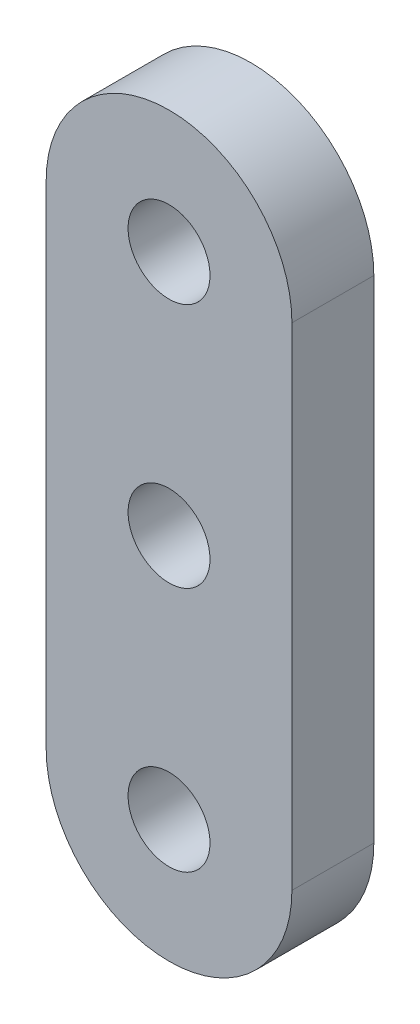
ISO-10303-21;
HEADER;
FILE_DESCRIPTION(('STEP AP214'),'2;1');
FILE_NAME('part.step','',(''),(''),'','','');
FILE_SCHEMA(('AUTOMOTIVE_DESIGN { 1 0 10303 214 1 1 1 1 }'));
ENDSEC;
DATA;
#1=APPLICATION_CONTEXT('core data for automotive mechanical design processes');
#2=APPLICATION_PROTOCOL_DEFINITION('international standard','automotive_design',2000,#1);
#3=PRODUCT_CONTEXT('',#1,'mechanical');
#4=PRODUCT('Part','Part','',(#3));
#5=PRODUCT_RELATED_PRODUCT_CATEGORY('part','',(#4));
#6=PRODUCT_DEFINITION_FORMATION('','',#4);
#7=PRODUCT_DEFINITION_CONTEXT('part definition',#1,'design');
#8=PRODUCT_DEFINITION('design','',#6,#7);
#9=PRODUCT_DEFINITION_SHAPE('','',#8);
#10=(LENGTH_UNIT() NAMED_UNIT(*) SI_UNIT(.MILLI.,.METRE.));
#11=(NAMED_UNIT(*) PLANE_ANGLE_UNIT() SI_UNIT($,.RADIAN.));
#12=(NAMED_UNIT(*) SI_UNIT($,.STERADIAN.) SOLID_ANGLE_UNIT());
#13=UNCERTAINTY_MEASURE_WITH_UNIT(LENGTH_MEASURE(1.E-05),#10,'distance_accuracy_value','');
#14=(GEOMETRIC_REPRESENTATION_CONTEXT(3) GLOBAL_UNCERTAINTY_ASSIGNED_CONTEXT((#13)) GLOBAL_UNIT_ASSIGNED_CONTEXT((#10,
#11,#12)) REPRESENTATION_CONTEXT('',''));
#15=CARTESIAN_POINT('',(0.,0.,0.));
#16=DIRECTION('',(0.,0.,1.));
#17=DIRECTION('',(1.,0.,0.));
#18=AXIS2_PLACEMENT_3D('',#15,#16,#17);
#19=CARTESIAN_POINT('',(208.7507761496,152.428489513,3.));
#20=DIRECTION('',(0.,0.,1.));
#21=DIRECTION('',(1.,0.,0.));
#22=AXIS2_PLACEMENT_3D('',#19,#20,#21);
#23=PLANE('',#22);
#24=CARTESIAN_POINT('',(208.7507761496,161.428489513,3.));
#25=DIRECTION('',(0.,0.,1.));
#26=DIRECTION('',(1.,0.,0.));
#27=AXIS2_PLACEMENT_3D('',#24,#25,#26);
#28=CIRCLE('',#27,1.5);
#29=CARTESIAN_POINT('',(210.2507761496,161.428489513,3.));
#30=VERTEX_POINT('',#29);
#31=EDGE_CURVE('E115',#30,#30,#28,.T.);
#32=ORIENTED_EDGE('',*,*,#31,.F.);
#33=EDGE_LOOP('',(#32));
#34=FACE_BOUND('',#33,.T.);
#35=CARTESIAN_POINT('',(208.7507761496,152.428489513,3.));
#36=DIRECTION('',(0.,0.,1.));
#37=DIRECTION('',(1.,0.,0.));
#38=AXIS2_PLACEMENT_3D('',#35,#36,#37);
#39=CIRCLE('',#38,4.5);
#40=CARTESIAN_POINT('',(204.2507761496,152.428489513,3.));
#41=VERTEX_POINT('',#40);
#42=CARTESIAN_POINT('',(213.2507761496,152.428489513,3.));
#43=VERTEX_POINT('',#42);
#44=EDGE_CURVE('E85',#41,#43,#39,.T.);
#45=ORIENTED_EDGE('',*,*,#44,.T.);
#46=DIRECTION('',(0.,1.,0.));
#47=VECTOR('',#46,1.);
#48=CARTESIAN_POINT('',(213.2507761496,152.428489513,3.));
#49=LINE('',#48,#47);
#50=CARTESIAN_POINT('',(213.2507761496,170.428489513,3.));
#51=VERTEX_POINT('',#50);
#52=EDGE_CURVE('E80',#43,#51,#49,.T.);
#53=ORIENTED_EDGE('',*,*,#52,.T.);
#54=CARTESIAN_POINT('',(208.7507761496,170.428489513,3.));
#55=DIRECTION('',(0.,0.,1.));
#56=DIRECTION('',(1.,0.,0.));
#57=AXIS2_PLACEMENT_3D('',#54,#55,#56);
#58=CIRCLE('',#57,4.5);
#59=CARTESIAN_POINT('',(204.2507761496,170.428489513,3.));
#60=VERTEX_POINT('',#59);
#61=EDGE_CURVE('E83',#51,#60,#58,.T.);
#62=ORIENTED_EDGE('',*,*,#61,.T.);
#63=DIRECTION('',(0.,-1.,0.));
#64=VECTOR('',#63,1.);
#65=CARTESIAN_POINT('',(204.2507761496,170.428489513,3.));
#66=LINE('',#65,#64);
#67=EDGE_CURVE('E50',#60,#41,#66,.T.);
#68=ORIENTED_EDGE('',*,*,#67,.T.);
#69=EDGE_LOOP('',(#45,#53,#62,#68));
#70=FACE_BOUND('',#69,.T.);
#71=CARTESIAN_POINT('',(208.7507761496,152.428489513,3.));
#72=DIRECTION('',(0.,0.,1.));
#73=DIRECTION('',(1.,0.,0.));
#74=AXIS2_PLACEMENT_3D('',#71,#72,#73);
#75=CIRCLE('',#74,1.5);
#76=CARTESIAN_POINT('',(210.2507761496,152.428489513,3.));
#77=VERTEX_POINT('',#76);
#78=EDGE_CURVE('E100',#77,#77,#75,.T.);
#79=ORIENTED_EDGE('',*,*,#78,.F.);
#80=EDGE_LOOP('',(#79));
#81=FACE_BOUND('',#80,.T.);
#82=CARTESIAN_POINT('',(208.7507761496,170.428489513,3.));
#83=DIRECTION('',(0.,0.,1.));
#84=DIRECTION('',(1.,0.,0.));
#85=AXIS2_PLACEMENT_3D('',#82,#83,#84);
#86=CIRCLE('',#85,1.5);
#87=CARTESIAN_POINT('',(210.2507761496,170.428489513,3.));
#88=VERTEX_POINT('',#87);
#89=EDGE_CURVE('E121',#88,#88,#86,.T.);
#90=ORIENTED_EDGE('',*,*,#89,.F.);
#91=EDGE_LOOP('',(#90));
#92=FACE_BOUND('',#91,.T.);
#93=ADVANCED_FACE('F33',(#34,#70,#81,#92),#23,.T.);
#94=CARTESIAN_POINT('',(208.7507761496,152.428489513,0.));
#95=DIRECTION('',(0.,0.,1.));
#96=DIRECTION('',(1.,0.,0.));
#97=AXIS2_PLACEMENT_3D('',#94,#95,#96);
#98=PLANE('',#97);
#99=CARTESIAN_POINT('',(208.7507761496,161.428489513,0.));
#100=DIRECTION('',(0.,0.,1.));
#101=DIRECTION('',(1.,0.,0.));
#102=AXIS2_PLACEMENT_3D('',#99,#100,#101);
#103=CIRCLE('',#102,1.5);
#104=CARTESIAN_POINT('',(210.2507761496,161.428489513,0.));
#105=VERTEX_POINT('',#104);
#106=EDGE_CURVE('E118',#105,#105,#103,.T.);
#107=ORIENTED_EDGE('',*,*,#106,.T.);
#108=EDGE_LOOP('',(#107));
#109=FACE_BOUND('',#108,.T.);
#110=CARTESIAN_POINT('',(208.7507761496,152.428489513,0.));
#111=DIRECTION('',(0.,0.,1.));
#112=DIRECTION('',(1.,0.,0.));
#113=AXIS2_PLACEMENT_3D('',#110,#111,#112);
#114=CIRCLE('',#113,4.5);
#115=CARTESIAN_POINT('',(204.2507761496,152.428489513,0.));
#116=VERTEX_POINT('',#115);
#117=CARTESIAN_POINT('',(213.2507761496,152.428489513,0.));
#118=VERTEX_POINT('',#117);
#119=EDGE_CURVE('E97',#116,#118,#114,.T.);
#120=ORIENTED_EDGE('',*,*,#119,.F.);
#121=DIRECTION('',(0.,-1.,0.));
#122=VECTOR('',#121,1.);
#123=CARTESIAN_POINT('',(204.2507761496,170.428489513,0.));
#124=LINE('',#123,#122);
#125=CARTESIAN_POINT('',(204.2507761496,170.428489513,0.));
#126=VERTEX_POINT('',#125);
#127=EDGE_CURVE('E73',#126,#116,#124,.T.);
#128=ORIENTED_EDGE('',*,*,#127,.F.);
#129=CARTESIAN_POINT('',(208.7507761496,170.428489513,0.));
#130=DIRECTION('',(0.,0.,1.));
#131=DIRECTION('',(1.,0.,0.));
#132=AXIS2_PLACEMENT_3D('',#129,#130,#131);
#133=CIRCLE('',#132,4.5);
#134=CARTESIAN_POINT('',(213.2507761496,170.428489513,0.));
#135=VERTEX_POINT('',#134);
#136=EDGE_CURVE('E67',#135,#126,#133,.T.);
#137=ORIENTED_EDGE('',*,*,#136,.F.);
#138=DIRECTION('',(0.,1.,0.));
#139=VECTOR('',#138,1.);
#140=CARTESIAN_POINT('',(213.2507761496,152.428489513,0.));
#141=LINE('',#140,#139);
#142=EDGE_CURVE('E89',#118,#135,#141,.T.);
#143=ORIENTED_EDGE('',*,*,#142,.F.);
#144=EDGE_LOOP('',(#120,#128,#137,#143));
#145=FACE_BOUND('',#144,.T.);
#146=CARTESIAN_POINT('',(208.7507761496,152.428489513,0.));
#147=DIRECTION('',(0.,0.,1.));
#148=DIRECTION('',(1.,0.,0.));
#149=AXIS2_PLACEMENT_3D('',#146,#147,#148);
#150=CIRCLE('',#149,1.5);
#151=CARTESIAN_POINT('',(210.2507761496,152.428489513,0.));
#152=VERTEX_POINT('',#151);
#153=EDGE_CURVE('E112',#152,#152,#150,.T.);
#154=ORIENTED_EDGE('',*,*,#153,.T.);
#155=EDGE_LOOP('',(#154));
#156=FACE_BOUND('',#155,.T.);
#157=CARTESIAN_POINT('',(208.7507761496,170.428489513,0.));
#158=DIRECTION('',(0.,0.,1.));
#159=DIRECTION('',(1.,0.,0.));
#160=AXIS2_PLACEMENT_3D('',#157,#158,#159);
#161=CIRCLE('',#160,1.5);
#162=CARTESIAN_POINT('',(210.2507761496,170.428489513,0.));
#163=VERTEX_POINT('',#162);
#164=EDGE_CURVE('E124',#163,#163,#161,.T.);
#165=ORIENTED_EDGE('',*,*,#164,.T.);
#166=EDGE_LOOP('',(#165));
#167=FACE_BOUND('',#166,.T.);
#168=ADVANCED_FACE('F108',(#109,#145,#156,#167),#98,.F.);
#169=CARTESIAN_POINT('',(208.7507761496,152.428489513,3.));
#170=DIRECTION('',(0.,0.,-1.));
#171=DIRECTION('',(-1.,0.,0.));
#172=AXIS2_PLACEMENT_3D('',#169,#170,#171);
#173=CYLINDRICAL_SURFACE('',#172,4.5);
#174=ORIENTED_EDGE('',*,*,#119,.T.);
#175=DIRECTION('',(0.,0.,-1.));
#176=VECTOR('',#175,1.);
#177=CARTESIAN_POINT('',(213.2507761496,152.428489513,3.));
#178=LINE('',#177,#176);
#179=EDGE_CURVE('E11',#43,#118,#178,.T.);
#180=ORIENTED_EDGE('',*,*,#179,.F.);
#181=ORIENTED_EDGE('',*,*,#44,.F.);
#182=DIRECTION('',(0.,0.,-1.));
#183=VECTOR('',#182,1.);
#184=CARTESIAN_POINT('',(204.2507761496,152.428489513,3.));
#185=LINE('',#184,#183);
#186=EDGE_CURVE('E93',#41,#116,#185,.T.);
#187=ORIENTED_EDGE('',*,*,#186,.T.);
#188=EDGE_LOOP('',(#174,#180,#181,#187));
#189=FACE_BOUND('',#188,.T.);
#190=ADVANCED_FACE('F35',(#189),#173,.T.);
#191=CARTESIAN_POINT('',(213.2507761496,152.428489513,3.));
#192=DIRECTION('',(-1.,0.,0.));
#193=DIRECTION('',(0.,0.,1.));
#194=AXIS2_PLACEMENT_3D('',#191,#192,#193);
#195=PLANE('',#194);
#196=ORIENTED_EDGE('',*,*,#142,.T.);
#197=DIRECTION('',(0.,0.,-1.));
#198=VECTOR('',#197,1.);
#199=CARTESIAN_POINT('',(213.2507761496,170.428489513,3.));
#200=LINE('',#199,#198);
#201=EDGE_CURVE('E42',#51,#135,#200,.T.);
#202=ORIENTED_EDGE('',*,*,#201,.F.);
#203=ORIENTED_EDGE('',*,*,#52,.F.);
#204=ORIENTED_EDGE('',*,*,#179,.T.);
#205=EDGE_LOOP('',(#196,#202,#203,#204));
#206=FACE_BOUND('',#205,.T.);
#207=ADVANCED_FACE('F88',(#206),#195,.F.);
#208=CARTESIAN_POINT('',(208.7507761496,170.428489513,3.));
#209=DIRECTION('',(0.,0.,-1.));
#210=DIRECTION('',(-1.,0.,0.));
#211=AXIS2_PLACEMENT_3D('',#208,#209,#210);
#212=CYLINDRICAL_SURFACE('',#211,4.5);
#213=ORIENTED_EDGE('',*,*,#136,.T.);
#214=DIRECTION('',(0.,0.,-1.));
#215=VECTOR('',#214,1.);
#216=CARTESIAN_POINT('',(204.2507761496,170.428489513,3.));
#217=LINE('',#216,#215);
#218=EDGE_CURVE('E90',#60,#126,#217,.T.);
#219=ORIENTED_EDGE('',*,*,#218,.F.);
#220=ORIENTED_EDGE('',*,*,#61,.F.);
#221=ORIENTED_EDGE('',*,*,#201,.T.);
#222=EDGE_LOOP('',(#213,#219,#220,#221));
#223=FACE_BOUND('',#222,.T.);
#224=ADVANCED_FACE('F91',(#223),#212,.T.);
#225=CARTESIAN_POINT('',(204.2507761496,170.428489513,3.));
#226=DIRECTION('',(1.,0.,0.));
#227=DIRECTION('',(0.,0.,-1.));
#228=AXIS2_PLACEMENT_3D('',#225,#226,#227);
#229=PLANE('',#228);
#230=ORIENTED_EDGE('',*,*,#127,.T.);
#231=ORIENTED_EDGE('',*,*,#186,.F.);
#232=ORIENTED_EDGE('',*,*,#67,.F.);
#233=ORIENTED_EDGE('',*,*,#218,.T.);
#234=EDGE_LOOP('',(#230,#231,#232,#233));
#235=FACE_BOUND('',#234,.T.);
#236=ADVANCED_FACE('F105',(#235),#229,.F.);
#237=CARTESIAN_POINT('',(208.7507761496,152.428489513,3.));
#238=DIRECTION('',(0.,0.,-1.));
#239=DIRECTION('',(-1.,0.,0.));
#240=AXIS2_PLACEMENT_3D('',#237,#238,#239);
#241=CYLINDRICAL_SURFACE('',#240,1.5);
#242=ORIENTED_EDGE('',*,*,#78,.T.);
#243=EDGE_LOOP('',(#242));
#244=FACE_BOUND('',#243,.T.);
#245=ORIENTED_EDGE('',*,*,#153,.F.);
#246=EDGE_LOOP('',(#245));
#247=FACE_BOUND('',#246,.T.);
#248=ADVANCED_FACE('F143',(#244,#247),#241,.F.);
#249=CARTESIAN_POINT('',(208.7507761496,161.428489513,3.));
#250=DIRECTION('',(0.,0.,-1.));
#251=DIRECTION('',(-1.,0.,0.));
#252=AXIS2_PLACEMENT_3D('',#249,#250,#251);
#253=CYLINDRICAL_SURFACE('',#252,1.5);
#254=ORIENTED_EDGE('',*,*,#31,.T.);
#255=EDGE_LOOP('',(#254));
#256=FACE_BOUND('',#255,.T.);
#257=ORIENTED_EDGE('',*,*,#106,.F.);
#258=EDGE_LOOP('',(#257));
#259=FACE_BOUND('',#258,.T.);
#260=ADVANCED_FACE('F189',(#256,#259),#253,.F.);
#261=CARTESIAN_POINT('',(208.7507761496,170.428489513,3.));
#262=DIRECTION('',(0.,0.,-1.));
#263=DIRECTION('',(-1.,0.,0.));
#264=AXIS2_PLACEMENT_3D('',#261,#262,#263);
#265=CYLINDRICAL_SURFACE('',#264,1.5);
#266=ORIENTED_EDGE('',*,*,#89,.T.);
#267=EDGE_LOOP('',(#266));
#268=FACE_BOUND('',#267,.T.);
#269=ORIENTED_EDGE('',*,*,#164,.F.);
#270=EDGE_LOOP('',(#269));
#271=FACE_BOUND('',#270,.T.);
#272=ADVANCED_FACE('F130',(#268,#271),#265,.F.);
#273=CLOSED_SHELL('',(#93,#168,#190,#207,#224,#236,#248,#260,#272));
#274=MANIFOLD_SOLID_BREP('B2',#273);
#275=ADVANCED_BREP_SHAPE_REPRESENTATION('',(#18,#274),#14);
#276=SHAPE_DEFINITION_REPRESENTATION(#9,#275);
ENDSEC;
END-ISO-10303-21;
